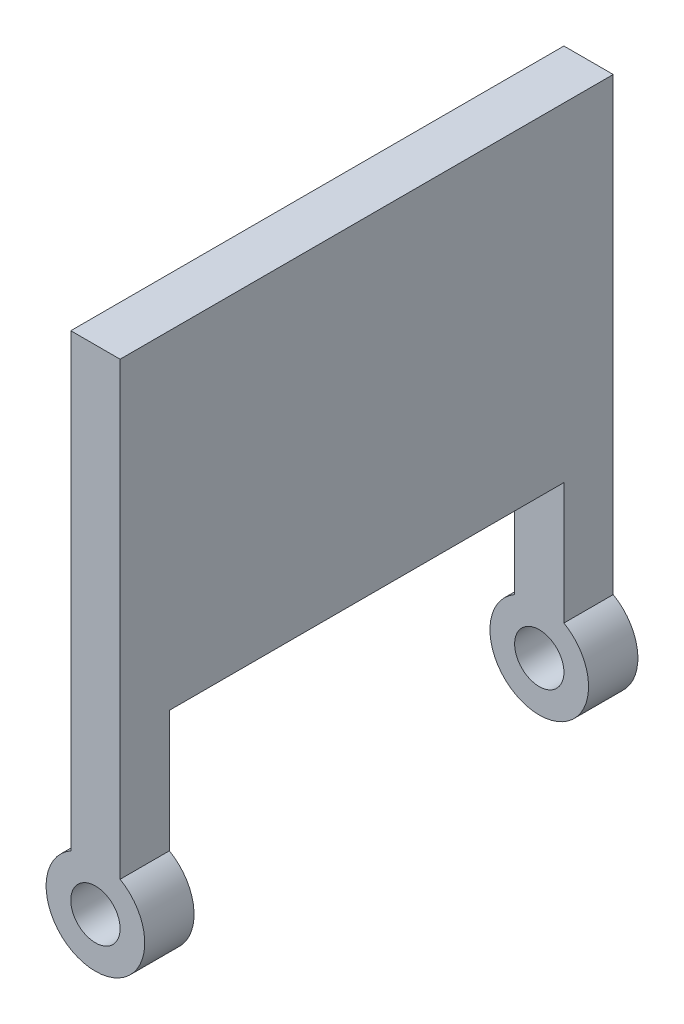
ISO-10303-21;
HEADER;
FILE_DESCRIPTION(('STEP AP214'),'2;1');
FILE_NAME('part.step','',(''),(''),'','','');
FILE_SCHEMA(('AUTOMOTIVE_DESIGN { 1 0 10303 214 1 1 1 1 }'));
ENDSEC;
DATA;
#1=APPLICATION_CONTEXT('core data for automotive mechanical design processes');
#2=APPLICATION_PROTOCOL_DEFINITION('international standard','automotive_design',2000,#1);
#3=PRODUCT_CONTEXT('',#1,'mechanical');
#4=PRODUCT('Part','Part','',(#3));
#5=PRODUCT_RELATED_PRODUCT_CATEGORY('part','',(#4));
#6=PRODUCT_DEFINITION_FORMATION('','',#4);
#7=PRODUCT_DEFINITION_CONTEXT('part definition',#1,'design');
#8=PRODUCT_DEFINITION('design','',#6,#7);
#9=PRODUCT_DEFINITION_SHAPE('','',#8);
#10=(LENGTH_UNIT() NAMED_UNIT(*) SI_UNIT(.MILLI.,.METRE.));
#11=(NAMED_UNIT(*) PLANE_ANGLE_UNIT() SI_UNIT($,.RADIAN.));
#12=(NAMED_UNIT(*) SI_UNIT($,.STERADIAN.) SOLID_ANGLE_UNIT());
#13=UNCERTAINTY_MEASURE_WITH_UNIT(LENGTH_MEASURE(1.E-05),#10,'distance_accuracy_value','');
#14=(GEOMETRIC_REPRESENTATION_CONTEXT(3) GLOBAL_UNCERTAINTY_ASSIGNED_CONTEXT((#13)) GLOBAL_UNIT_ASSIGNED_CONTEXT((#10,
#11,#12)) REPRESENTATION_CONTEXT('',''));
#15=CARTESIAN_POINT('',(0.,0.,0.));
#16=DIRECTION('',(0.,0.,1.));
#17=DIRECTION('',(1.,0.,0.));
#18=AXIS2_PLACEMENT_3D('',#15,#16,#17);
#19=CARTESIAN_POINT('',(0.,0.,6.));
#20=DIRECTION('',(0.,0.,1.));
#21=DIRECTION('',(1.,0.,0.));
#22=AXIS2_PLACEMENT_3D('',#19,#20,#21);
#23=PLANE('',#22);
#24=DIRECTION('',(1.,0.,0.));
#25=VECTOR('',#24,1.);
#26=CARTESIAN_POINT('',(-3.,20.,6.));
#27=LINE('',#26,#25);
#28=CARTESIAN_POINT('',(-3.,20.,6.));
#29=VERTEX_POINT('',#28);
#30=CARTESIAN_POINT('',(3.,20.,6.));
#31=VERTEX_POINT('',#30);
#32=EDGE_CURVE('E48',#29,#31,#27,.T.);
#33=ORIENTED_EDGE('',*,*,#32,.F.);
#34=DIRECTION('',(0.,-1.,0.));
#35=VECTOR('',#34,1.);
#36=CARTESIAN_POINT('',(-3.,60.,6.));
#37=LINE('',#36,#35);
#38=CARTESIAN_POINT('',(-3.,5.19615242270663,6.));
#39=VERTEX_POINT('',#38);
#40=EDGE_CURVE('E53',#29,#39,#37,.T.);
#41=ORIENTED_EDGE('',*,*,#40,.T.);
#42=CARTESIAN_POINT('',(0.,0.,6.));
#43=DIRECTION('',(0.,0.,1.));
#44=DIRECTION('',(1.,0.,0.));
#45=AXIS2_PLACEMENT_3D('',#42,#43,#44);
#46=CIRCLE('',#45,6.);
#47=CARTESIAN_POINT('',(3.,5.19615242270663,6.));
#48=VERTEX_POINT('',#47);
#49=EDGE_CURVE('E84',#39,#48,#46,.T.);
#50=ORIENTED_EDGE('',*,*,#49,.T.);
#51=DIRECTION('',(0.,1.,0.));
#52=VECTOR('',#51,1.);
#53=CARTESIAN_POINT('',(3.,60.,6.));
#54=LINE('',#53,#52);
#55=EDGE_CURVE('E164',#48,#31,#54,.T.);
#56=ORIENTED_EDGE('',*,*,#55,.T.);
#57=EDGE_LOOP('',(#33,#41,#50,#56));
#58=FACE_BOUND('',#57,.T.);
#59=CARTESIAN_POINT('',(0.,0.,6.));
#60=DIRECTION('',(0.,0.,1.));
#61=DIRECTION('',(1.,0.,0.));
#62=AXIS2_PLACEMENT_3D('',#59,#60,#61);
#63=CIRCLE('',#62,3.);
#64=CARTESIAN_POINT('',(3.,0.,6.));
#65=VERTEX_POINT('',#64);
#66=EDGE_CURVE('E95',#65,#65,#63,.T.);
#67=ORIENTED_EDGE('',*,*,#66,.F.);
#68=EDGE_LOOP('',(#67));
#69=FACE_BOUND('',#68,.T.);
#70=ADVANCED_FACE('F33',(#58,#69),#23,.T.);
#71=CARTESIAN_POINT('',(0.,0.,0.));
#72=DIRECTION('',(0.,0.,1.));
#73=DIRECTION('',(1.,0.,0.));
#74=AXIS2_PLACEMENT_3D('',#71,#72,#73);
#75=PLANE('',#74);
#76=CARTESIAN_POINT('',(0.,0.,0.));
#77=DIRECTION('',(0.,0.,1.));
#78=DIRECTION('',(1.,0.,0.));
#79=AXIS2_PLACEMENT_3D('',#76,#77,#78);
#80=CIRCLE('',#79,6.);
#81=CARTESIAN_POINT('',(-3.,5.19615242270663,0.));
#82=VERTEX_POINT('',#81);
#83=CARTESIAN_POINT('',(3.,5.19615242270663,0.));
#84=VERTEX_POINT('',#83);
#85=EDGE_CURVE('E90',#82,#84,#80,.T.);
#86=ORIENTED_EDGE('',*,*,#85,.F.);
#87=DIRECTION('',(0.,-1.,0.));
#88=VECTOR('',#87,1.);
#89=CARTESIAN_POINT('',(-3.,60.,0.));
#90=LINE('',#89,#88);
#91=CARTESIAN_POINT('',(-3.,60.,0.));
#92=VERTEX_POINT('',#91);
#93=EDGE_CURVE('E73',#92,#82,#90,.T.);
#94=ORIENTED_EDGE('',*,*,#93,.F.);
#95=DIRECTION('',(-1.,0.,0.));
#96=VECTOR('',#95,1.);
#97=CARTESIAN_POINT('',(3.,60.,0.));
#98=LINE('',#97,#96);
#99=CARTESIAN_POINT('',(3.,60.,0.));
#100=VERTEX_POINT('',#99);
#101=EDGE_CURVE('E85',#100,#92,#98,.T.);
#102=ORIENTED_EDGE('',*,*,#101,.F.);
#103=DIRECTION('',(0.,1.,0.));
#104=VECTOR('',#103,1.);
#105=CARTESIAN_POINT('',(3.,60.,0.));
#106=LINE('',#105,#104);
#107=EDGE_CURVE('E94',#84,#100,#106,.T.);
#108=ORIENTED_EDGE('',*,*,#107,.F.);
#109=EDGE_LOOP('',(#86,#94,#102,#108));
#110=FACE_BOUND('',#109,.T.);
#111=CARTESIAN_POINT('',(0.,0.,0.));
#112=DIRECTION('',(0.,0.,1.));
#113=DIRECTION('',(1.,0.,0.));
#114=AXIS2_PLACEMENT_3D('',#111,#112,#113);
#115=CIRCLE('',#114,3.);
#116=CARTESIAN_POINT('',(3.,0.,0.));
#117=VERTEX_POINT('',#116);
#118=EDGE_CURVE('E99',#117,#117,#115,.T.);
#119=ORIENTED_EDGE('',*,*,#118,.T.);
#120=EDGE_LOOP('',(#119));
#121=FACE_BOUND('',#120,.T.);
#122=ADVANCED_FACE('F92',(#110,#121),#75,.F.);
#123=CARTESIAN_POINT('',(0.,0.,6.));
#124=DIRECTION('',(0.,0.,-1.));
#125=DIRECTION('',(-1.,0.,0.));
#126=AXIS2_PLACEMENT_3D('',#123,#124,#125);
#127=CYLINDRICAL_SURFACE('',#126,6.);
#128=ORIENTED_EDGE('',*,*,#85,.T.);
#129=DIRECTION('',(0.,0.,-1.));
#130=VECTOR('',#129,1.);
#131=CARTESIAN_POINT('',(3.,5.19615242270663,6.));
#132=LINE('',#131,#130);
#133=EDGE_CURVE('E11',#48,#84,#132,.T.);
#134=ORIENTED_EDGE('',*,*,#133,.F.);
#135=ORIENTED_EDGE('',*,*,#49,.F.);
#136=DIRECTION('',(0.,0.,-1.));
#137=VECTOR('',#136,1.);
#138=CARTESIAN_POINT('',(-3.,5.19615242270663,6.));
#139=LINE('',#138,#137);
#140=EDGE_CURVE('E76',#39,#82,#139,.T.);
#141=ORIENTED_EDGE('',*,*,#140,.T.);
#142=EDGE_LOOP('',(#128,#134,#135,#141));
#143=FACE_BOUND('',#142,.T.);
#144=ADVANCED_FACE('F35',(#143),#127,.T.);
#145=CARTESIAN_POINT('',(3.,60.,6.));
#146=DIRECTION('',(-1.,0.,0.));
#147=DIRECTION('',(0.,-1.,0.));
#148=AXIS2_PLACEMENT_3D('',#145,#146,#147);
#149=PLANE('',#148);
#150=ORIENTED_EDGE('',*,*,#107,.T.);
#151=DIRECTION('',(0.,0.,-1.));
#152=VECTOR('',#151,1.);
#153=CARTESIAN_POINT('',(3.,60.,6.));
#154=LINE('',#153,#152);
#155=CARTESIAN_POINT('',(3.,60.,60.));
#156=VERTEX_POINT('',#155);
#157=EDGE_CURVE('E41',#156,#100,#154,.T.);
#158=ORIENTED_EDGE('',*,*,#157,.F.);
#159=DIRECTION('',(0.,1.,0.));
#160=VECTOR('',#159,1.);
#161=CARTESIAN_POINT('',(3.,60.,60.));
#162=LINE('',#161,#160);
#163=CARTESIAN_POINT('',(3.,5.19615242270663,60.));
#164=VERTEX_POINT('',#163);
#165=EDGE_CURVE('E119',#164,#156,#162,.T.);
#166=ORIENTED_EDGE('',*,*,#165,.F.);
#167=DIRECTION('',(0.,0.,-1.));
#168=VECTOR('',#167,1.);
#169=CARTESIAN_POINT('',(3.,5.19615242270663,60.));
#170=LINE('',#169,#168);
#171=CARTESIAN_POINT('',(3.,5.19615242270663,54.));
#172=VERTEX_POINT('',#171);
#173=EDGE_CURVE('E150',#164,#172,#170,.T.);
#174=ORIENTED_EDGE('',*,*,#173,.T.);
#175=DIRECTION('',(0.,1.,0.));
#176=VECTOR('',#175,1.);
#177=CARTESIAN_POINT('',(3.,60.,54.));
#178=LINE('',#177,#176);
#179=CARTESIAN_POINT('',(3.,20.,54.));
#180=VERTEX_POINT('',#179);
#181=EDGE_CURVE('E142',#172,#180,#178,.T.);
#182=ORIENTED_EDGE('',*,*,#181,.T.);
#183=DIRECTION('',(0.,0.,-1.));
#184=VECTOR('',#183,1.);
#185=CARTESIAN_POINT('',(3.,20.,54.));
#186=LINE('',#185,#184);
#187=EDGE_CURVE('E155',#180,#31,#186,.T.);
#188=ORIENTED_EDGE('',*,*,#187,.T.);
#189=ORIENTED_EDGE('',*,*,#55,.F.);
#190=ORIENTED_EDGE('',*,*,#133,.T.);
#191=EDGE_LOOP('',(#150,#158,#166,#174,#182,#188,#189,#190));
#192=FACE_BOUND('',#191,.T.);
#193=ADVANCED_FACE('F116',(#192),#149,.F.);
#194=CARTESIAN_POINT('',(3.,60.,6.));
#195=DIRECTION('',(0.,-1.,0.));
#196=DIRECTION('',(0.,0.,-1.));
#197=AXIS2_PLACEMENT_3D('',#194,#195,#196);
#198=PLANE('',#197);
#199=ORIENTED_EDGE('',*,*,#101,.T.);
#200=DIRECTION('',(0.,0.,-1.));
#201=VECTOR('',#200,1.);
#202=CARTESIAN_POINT('',(-3.,60.,6.));
#203=LINE('',#202,#201);
#204=CARTESIAN_POINT('',(-3.,60.,60.));
#205=VERTEX_POINT('',#204);
#206=EDGE_CURVE('E80',#205,#92,#203,.T.);
#207=ORIENTED_EDGE('',*,*,#206,.F.);
#208=DIRECTION('',(-1.,0.,0.));
#209=VECTOR('',#208,1.);
#210=CARTESIAN_POINT('',(-3.,60.,60.));
#211=LINE('',#210,#209);
#212=EDGE_CURVE('E112',#156,#205,#211,.T.);
#213=ORIENTED_EDGE('',*,*,#212,.F.);
#214=ORIENTED_EDGE('',*,*,#157,.T.);
#215=EDGE_LOOP('',(#199,#207,#213,#214));
#216=FACE_BOUND('',#215,.T.);
#217=ADVANCED_FACE('F109',(#216),#198,.F.);
#218=CARTESIAN_POINT('',(-3.,60.,6.));
#219=DIRECTION('',(1.,0.,0.));
#220=DIRECTION('',(0.,1.,0.));
#221=AXIS2_PLACEMENT_3D('',#218,#219,#220);
#222=PLANE('',#221);
#223=ORIENTED_EDGE('',*,*,#93,.T.);
#224=ORIENTED_EDGE('',*,*,#140,.F.);
#225=ORIENTED_EDGE('',*,*,#40,.F.);
#226=DIRECTION('',(0.,0.,-1.));
#227=VECTOR('',#226,1.);
#228=CARTESIAN_POINT('',(-3.,20.,54.));
#229=LINE('',#228,#227);
#230=CARTESIAN_POINT('',(-3.,20.,54.));
#231=VERTEX_POINT('',#230);
#232=EDGE_CURVE('E159',#231,#29,#229,.T.);
#233=ORIENTED_EDGE('',*,*,#232,.F.);
#234=DIRECTION('',(0.,-1.,0.));
#235=VECTOR('',#234,1.);
#236=CARTESIAN_POINT('',(-3.,5.19615242270663,54.));
#237=LINE('',#236,#235);
#238=CARTESIAN_POINT('',(-3.,5.19615242270663,54.));
#239=VERTEX_POINT('',#238);
#240=EDGE_CURVE('E133',#231,#239,#237,.T.);
#241=ORIENTED_EDGE('',*,*,#240,.T.);
#242=DIRECTION('',(0.,0.,-1.));
#243=VECTOR('',#242,1.);
#244=CARTESIAN_POINT('',(-3.,5.19615242270663,60.));
#245=LINE('',#244,#243);
#246=CARTESIAN_POINT('',(-3.,5.19615242270663,60.));
#247=VERTEX_POINT('',#246);
#248=EDGE_CURVE('E138',#247,#239,#245,.T.);
#249=ORIENTED_EDGE('',*,*,#248,.F.);
#250=DIRECTION('',(0.,-1.,0.));
#251=VECTOR('',#250,1.);
#252=CARTESIAN_POINT('',(-3.,5.19615242270663,60.));
#253=LINE('',#252,#251);
#254=EDGE_CURVE('E131',#205,#247,#253,.T.);
#255=ORIENTED_EDGE('',*,*,#254,.F.);
#256=ORIENTED_EDGE('',*,*,#206,.T.);
#257=EDGE_LOOP('',(#223,#224,#225,#233,#241,#249,#255,#256));
#258=FACE_BOUND('',#257,.T.);
#259=ADVANCED_FACE('F75',(#258),#222,.F.);
#260=CARTESIAN_POINT('',(0.,0.,6.));
#261=DIRECTION('',(0.,0.,-1.));
#262=DIRECTION('',(-1.,0.,0.));
#263=AXIS2_PLACEMENT_3D('',#260,#261,#262);
#264=CYLINDRICAL_SURFACE('',#263,3.);
#265=ORIENTED_EDGE('',*,*,#66,.T.);
#266=EDGE_LOOP('',(#265));
#267=FACE_BOUND('',#266,.T.);
#268=ORIENTED_EDGE('',*,*,#118,.F.);
#269=EDGE_LOOP('',(#268));
#270=FACE_BOUND('',#269,.T.);
#271=ADVANCED_FACE('F210',(#267,#270),#264,.F.);
#272=CARTESIAN_POINT('',(-3.,20.,54.));
#273=DIRECTION('',(0.,1.,0.));
#274=DIRECTION('',(0.,0.,1.));
#275=AXIS2_PLACEMENT_3D('',#272,#273,#274);
#276=PLANE('',#275);
#277=ORIENTED_EDGE('',*,*,#32,.T.);
#278=ORIENTED_EDGE('',*,*,#187,.F.);
#279=DIRECTION('',(1.,0.,0.));
#280=VECTOR('',#279,1.);
#281=CARTESIAN_POINT('',(-3.,20.,54.));
#282=LINE('',#281,#280);
#283=EDGE_CURVE('E152',#231,#180,#282,.T.);
#284=ORIENTED_EDGE('',*,*,#283,.F.);
#285=ORIENTED_EDGE('',*,*,#232,.T.);
#286=EDGE_LOOP('',(#277,#278,#284,#285));
#287=FACE_BOUND('',#286,.T.);
#288=ADVANCED_FACE('F170',(#287),#276,.F.);
#289=CARTESIAN_POINT('',(0.,0.,54.));
#290=DIRECTION('',(0.,0.,1.));
#291=DIRECTION('',(1.,0.,0.));
#292=AXIS2_PLACEMENT_3D('',#289,#290,#291);
#293=PLANE('',#292);
#294=CARTESIAN_POINT('',(0.,0.,54.));
#295=DIRECTION('',(0.,0.,1.));
#296=DIRECTION('',(1.,0.,0.));
#297=AXIS2_PLACEMENT_3D('',#294,#295,#296);
#298=CIRCLE('',#297,3.);
#299=CARTESIAN_POINT('',(3.,0.,54.));
#300=VERTEX_POINT('',#299);
#301=EDGE_CURVE('E310',#300,#300,#298,.T.);
#302=ORIENTED_EDGE('',*,*,#301,.T.);
#303=EDGE_LOOP('',(#302));
#304=FACE_BOUND('',#303,.T.);
#305=ORIENTED_EDGE('',*,*,#240,.F.);
#306=ORIENTED_EDGE('',*,*,#283,.T.);
#307=ORIENTED_EDGE('',*,*,#181,.F.);
#308=CARTESIAN_POINT('',(0.,0.,54.));
#309=DIRECTION('',(0.,0.,1.));
#310=DIRECTION('',(1.,0.,0.));
#311=AXIS2_PLACEMENT_3D('',#308,#309,#310);
#312=CIRCLE('',#311,6.);
#313=EDGE_CURVE('E139',#239,#172,#312,.T.);
#314=ORIENTED_EDGE('',*,*,#313,.F.);
#315=EDGE_LOOP('',(#305,#306,#307,#314));
#316=FACE_BOUND('',#315,.T.);
#317=ADVANCED_FACE('F180',(#304,#316),#293,.F.);
#318=CARTESIAN_POINT('',(0.,0.,60.));
#319=DIRECTION('',(0.,0.,1.));
#320=DIRECTION('',(1.,0.,0.));
#321=AXIS2_PLACEMENT_3D('',#318,#319,#320);
#322=PLANE('',#321);
#323=CARTESIAN_POINT('',(0.,0.,60.));
#324=DIRECTION('',(0.,0.,1.));
#325=DIRECTION('',(1.,0.,0.));
#326=AXIS2_PLACEMENT_3D('',#323,#324,#325);
#327=CIRCLE('',#326,6.);
#328=EDGE_CURVE('E128',#247,#164,#327,.T.);
#329=ORIENTED_EDGE('',*,*,#328,.T.);
#330=ORIENTED_EDGE('',*,*,#165,.T.);
#331=ORIENTED_EDGE('',*,*,#212,.T.);
#332=ORIENTED_EDGE('',*,*,#254,.T.);
#333=EDGE_LOOP('',(#329,#330,#331,#332));
#334=FACE_BOUND('',#333,.T.);
#335=CARTESIAN_POINT('',(0.,0.,60.));
#336=DIRECTION('',(0.,0.,1.));
#337=DIRECTION('',(1.,0.,0.));
#338=AXIS2_PLACEMENT_3D('',#335,#336,#337);
#339=CIRCLE('',#338,3.);
#340=CARTESIAN_POINT('',(3.,0.,60.));
#341=VERTEX_POINT('',#340);
#342=EDGE_CURVE('E143',#341,#341,#339,.T.);
#343=ORIENTED_EDGE('',*,*,#342,.F.);
#344=EDGE_LOOP('',(#343));
#345=FACE_BOUND('',#344,.T.);
#346=ADVANCED_FACE('F124',(#334,#345),#322,.T.);
#347=CARTESIAN_POINT('',(0.,0.,60.));
#348=DIRECTION('',(0.,0.,-1.));
#349=DIRECTION('',(-1.,0.,0.));
#350=AXIS2_PLACEMENT_3D('',#347,#348,#349);
#351=CYLINDRICAL_SURFACE('',#350,6.);
#352=ORIENTED_EDGE('',*,*,#313,.T.);
#353=ORIENTED_EDGE('',*,*,#173,.F.);
#354=ORIENTED_EDGE('',*,*,#328,.F.);
#355=ORIENTED_EDGE('',*,*,#248,.T.);
#356=EDGE_LOOP('',(#352,#353,#354,#355));
#357=FACE_BOUND('',#356,.T.);
#358=ADVANCED_FACE('F189',(#357),#351,.T.);
#359=CARTESIAN_POINT('',(0.,0.,60.));
#360=DIRECTION('',(0.,0.,-1.));
#361=DIRECTION('',(-1.,0.,0.));
#362=AXIS2_PLACEMENT_3D('',#359,#360,#361);
#363=CYLINDRICAL_SURFACE('',#362,3.);
#364=ORIENTED_EDGE('',*,*,#342,.T.);
#365=EDGE_LOOP('',(#364));
#366=FACE_BOUND('',#365,.T.);
#367=ORIENTED_EDGE('',*,*,#301,.F.);
#368=EDGE_LOOP('',(#367));
#369=FACE_BOUND('',#368,.T.);
#370=ADVANCED_FACE('F192',(#366,#369),#363,.F.);
#371=CLOSED_SHELL('',(#70,#122,#144,#193,#217,#259,#271,#288,#317,#346,#358,#370));
#372=MANIFOLD_SOLID_BREP('B2',#371);
#373=ADVANCED_BREP_SHAPE_REPRESENTATION('',(#18,#372),#14);
#374=SHAPE_DEFINITION_REPRESENTATION(#9,#373);
ENDSEC;
END-ISO-10303-21;
